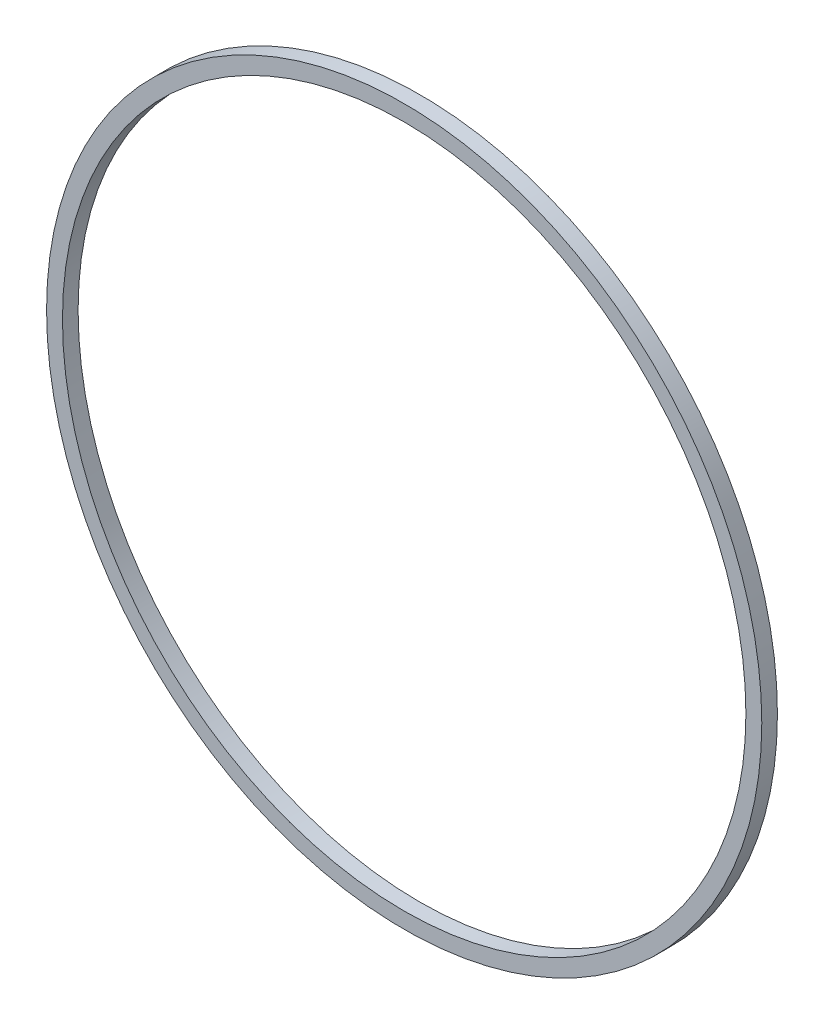
ISO-10303-21;
HEADER;
FILE_DESCRIPTION(('STEP AP214'),'2;1');
FILE_NAME('part.step','',(''),(''),'','','');
FILE_SCHEMA(('AUTOMOTIVE_DESIGN { 1 0 10303 214 1 1 1 1 }'));
ENDSEC;
DATA;
#1=APPLICATION_CONTEXT('core data for automotive mechanical design processes');
#2=APPLICATION_PROTOCOL_DEFINITION('international standard','automotive_design',2000,#1);
#3=PRODUCT_CONTEXT('',#1,'mechanical');
#4=PRODUCT('Part','Part','',(#3));
#5=PRODUCT_RELATED_PRODUCT_CATEGORY('part','',(#4));
#6=PRODUCT_DEFINITION_FORMATION('','',#4);
#7=PRODUCT_DEFINITION_CONTEXT('part definition',#1,'design');
#8=PRODUCT_DEFINITION('design','',#6,#7);
#9=PRODUCT_DEFINITION_SHAPE('','',#8);
#10=(LENGTH_UNIT() NAMED_UNIT(*) SI_UNIT(.MILLI.,.METRE.));
#11=(NAMED_UNIT(*) PLANE_ANGLE_UNIT() SI_UNIT($,.RADIAN.));
#12=(NAMED_UNIT(*) SI_UNIT($,.STERADIAN.) SOLID_ANGLE_UNIT());
#13=UNCERTAINTY_MEASURE_WITH_UNIT(LENGTH_MEASURE(1.E-05),#10,'distance_accuracy_value','');
#14=(GEOMETRIC_REPRESENTATION_CONTEXT(3) GLOBAL_UNCERTAINTY_ASSIGNED_CONTEXT((#13)) GLOBAL_UNIT_ASSIGNED_CONTEXT((#10,
#11,#12)) REPRESENTATION_CONTEXT('',''));
#15=CARTESIAN_POINT('',(0.,0.,0.));
#16=DIRECTION('',(0.,0.,1.));
#17=DIRECTION('',(1.,0.,0.));
#18=AXIS2_PLACEMENT_3D('',#15,#16,#17);
#19=CARTESIAN_POINT('',(0.,0.,0.));
#20=DIRECTION('',(0.,0.,1.));
#21=DIRECTION('',(1.,0.,0.));
#22=AXIS2_PLACEMENT_3D('',#19,#20,#21);
#23=PLANE('',#22);
#24=CARTESIAN_POINT('',(0.,0.,0.));
#25=DIRECTION('',(0.,0.,1.));
#26=DIRECTION('',(1.,0.,0.));
#27=AXIS2_PLACEMENT_3D('',#24,#25,#26);
#28=CIRCLE('',#27,1.0922);
#29=CARTESIAN_POINT('',(1.0922,0.,0.));
#30=VERTEX_POINT('',#29);
#31=EDGE_CURVE('E27',#30,#30,#28,.T.);
#32=ORIENTED_EDGE('',*,*,#31,.T.);
#33=EDGE_LOOP('',(#32));
#34=FACE_BOUND('',#33,.T.);
#35=CARTESIAN_POINT('',(0.,0.,0.));
#36=DIRECTION('',(0.,0.,1.));
#37=DIRECTION('',(1.,0.,0.));
#38=AXIS2_PLACEMENT_3D('',#35,#36,#37);
#39=CIRCLE('',#38,1.143);
#40=CARTESIAN_POINT('',(1.143,0.,0.));
#41=VERTEX_POINT('',#40);
#42=EDGE_CURVE('E18',#41,#41,#39,.T.);
#43=ORIENTED_EDGE('',*,*,#42,.F.);
#44=EDGE_LOOP('',(#43));
#45=FACE_BOUND('',#44,.T.);
#46=ADVANCED_FACE('F15',(#34,#45),#23,.F.);
#47=CARTESIAN_POINT('',(0.,0.,0.));
#48=DIRECTION('',(0.,0.,1.));
#49=DIRECTION('',(1.,0.,0.));
#50=AXIS2_PLACEMENT_3D('',#47,#48,#49);
#51=CYLINDRICAL_SURFACE('',#50,1.143);
#52=CARTESIAN_POINT('',(0.,0.,0.05));
#53=DIRECTION('',(0.,0.,1.));
#54=DIRECTION('',(1.,0.,0.));
#55=AXIS2_PLACEMENT_3D('',#52,#53,#54);
#56=CIRCLE('',#55,1.143);
#57=CARTESIAN_POINT('',(1.143,0.,0.05));
#58=VERTEX_POINT('',#57);
#59=EDGE_CURVE('E22',#58,#58,#56,.T.);
#60=ORIENTED_EDGE('',*,*,#59,.F.);
#61=EDGE_LOOP('',(#60));
#62=FACE_BOUND('',#61,.T.);
#63=ORIENTED_EDGE('',*,*,#42,.T.);
#64=EDGE_LOOP('',(#63));
#65=FACE_BOUND('',#64,.T.);
#66=ADVANCED_FACE('F35',(#62,#65),#51,.T.);
#67=CARTESIAN_POINT('',(0.,0.,0.));
#68=DIRECTION('',(0.,0.,1.));
#69=DIRECTION('',(1.,0.,0.));
#70=AXIS2_PLACEMENT_3D('',#67,#68,#69);
#71=CYLINDRICAL_SURFACE('',#70,1.0922);
#72=CARTESIAN_POINT('',(0.,0.,0.05));
#73=DIRECTION('',(0.,0.,1.));
#74=DIRECTION('',(1.,0.,0.));
#75=AXIS2_PLACEMENT_3D('',#72,#73,#74);
#76=CIRCLE('',#75,1.0922);
#77=CARTESIAN_POINT('',(1.0922,0.,0.05));
#78=VERTEX_POINT('',#77);
#79=EDGE_CURVE('E10',#78,#78,#76,.F.);
#80=ORIENTED_EDGE('',*,*,#79,.F.);
#81=EDGE_LOOP('',(#80));
#82=FACE_BOUND('',#81,.T.);
#83=ORIENTED_EDGE('',*,*,#31,.F.);
#84=EDGE_LOOP('',(#83));
#85=FACE_BOUND('',#84,.T.);
#86=ADVANCED_FACE('F42',(#82,#85),#71,.F.);
#87=CARTESIAN_POINT('',(0.,0.,0.05));
#88=DIRECTION('',(0.,0.,1.));
#89=DIRECTION('',(1.,0.,0.));
#90=AXIS2_PLACEMENT_3D('',#87,#88,#89);
#91=PLANE('',#90);
#92=ORIENTED_EDGE('',*,*,#79,.T.);
#93=EDGE_LOOP('',(#92));
#94=FACE_BOUND('',#93,.T.);
#95=ORIENTED_EDGE('',*,*,#59,.T.);
#96=EDGE_LOOP('',(#95));
#97=FACE_BOUND('',#96,.T.);
#98=ADVANCED_FACE('F44',(#94,#97),#91,.T.);
#99=CLOSED_SHELL('',(#46,#66,#86,#98));
#100=MANIFOLD_SOLID_BREP('B1',#99);
#101=ADVANCED_BREP_SHAPE_REPRESENTATION('',(#18,#100),#14);
#102=SHAPE_DEFINITION_REPRESENTATION(#9,#101);
ENDSEC;
END-ISO-10303-21;
